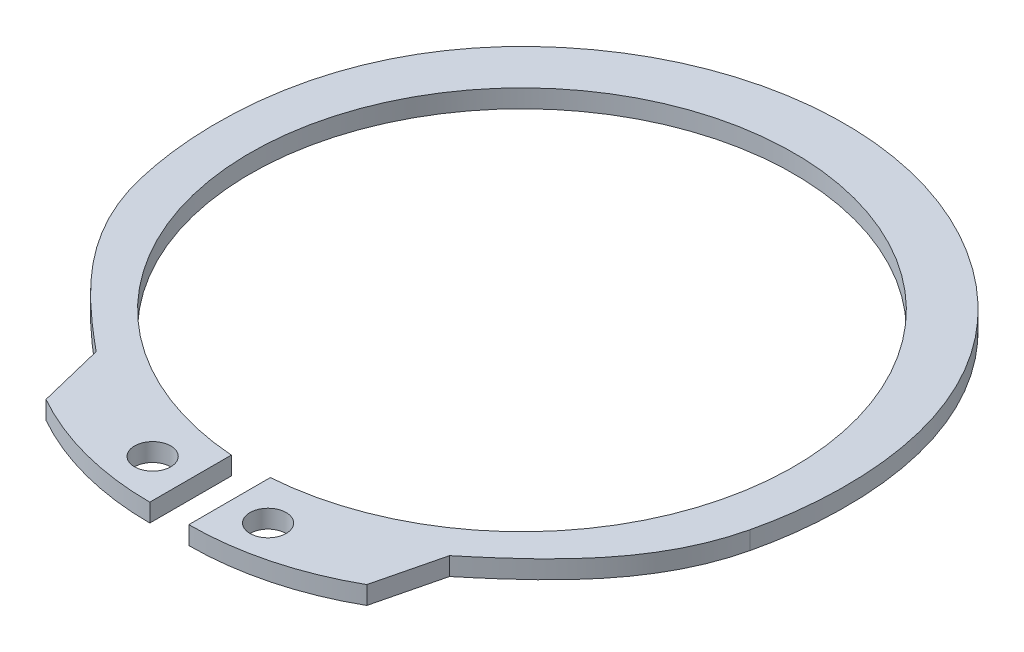
ISO-10303-21;
HEADER;
FILE_DESCRIPTION(('STEP AP214'),'2;1');
FILE_NAME('part.step','',(''),(''),'','','');
FILE_SCHEMA(('AUTOMOTIVE_DESIGN { 1 0 10303 214 1 1 1 1 }'));
ENDSEC;
DATA;
#1=APPLICATION_CONTEXT('core data for automotive mechanical design processes');
#2=APPLICATION_PROTOCOL_DEFINITION('international standard','automotive_design',2000,#1);
#3=PRODUCT_CONTEXT('',#1,'mechanical');
#4=PRODUCT('Part','Part','',(#3));
#5=PRODUCT_RELATED_PRODUCT_CATEGORY('part','',(#4));
#6=PRODUCT_DEFINITION_FORMATION('','',#4);
#7=PRODUCT_DEFINITION_CONTEXT('part definition',#1,'design');
#8=PRODUCT_DEFINITION('design','',#6,#7);
#9=PRODUCT_DEFINITION_SHAPE('','',#8);
#10=(LENGTH_UNIT() NAMED_UNIT(*) SI_UNIT(.MILLI.,.METRE.));
#11=(NAMED_UNIT(*) PLANE_ANGLE_UNIT() SI_UNIT($,.RADIAN.));
#12=(NAMED_UNIT(*) SI_UNIT($,.STERADIAN.) SOLID_ANGLE_UNIT());
#13=UNCERTAINTY_MEASURE_WITH_UNIT(LENGTH_MEASURE(1.E-05),#10,'distance_accuracy_value','');
#14=(GEOMETRIC_REPRESENTATION_CONTEXT(3) GLOBAL_UNCERTAINTY_ASSIGNED_CONTEXT((#13)) GLOBAL_UNIT_ASSIGNED_CONTEXT((#10,
#11,#12)) REPRESENTATION_CONTEXT('',''));
#15=CARTESIAN_POINT('',(0.,0.,0.));
#16=DIRECTION('',(0.,0.,1.));
#17=DIRECTION('',(1.,0.,0.));
#18=AXIS2_PLACEMENT_3D('',#15,#16,#17);
#19=CARTESIAN_POINT('',(-24.5646187762163,2.,-25.7670235840146));
#20=CARTESIAN_POINT('',(-32.2510077667625,2.,-18.439315954034));
#21=CARTESIAN_POINT('',(-35.7190076851156,2.,-6.21673721038981));
#22=CARTESIAN_POINT('',(-34.2765179406973,2.,5.5416940079121));
#23=CARTESIAN_POINT('',(-33.6081046392494,2.,8.41468235261205));
#24=B_SPLINE_CURVE_WITH_KNOTS('',3,(#19,#20,#21,#22,#23),.UNSPECIFIED.,.F.,.F.,(4,1,4),(0.,
0.765438226069232,1.),.UNSPECIFIED.);
#25=DIRECTION('',(0.,-1.,0.));
#26=VECTOR('',#25,1.);
#27=SURFACE_OF_LINEAR_EXTRUSION('',#24,#26);
#28=CARTESIAN_POINT('',(-24.5646187762163,0.,-25.7670235840146));
#29=CARTESIAN_POINT('',(-32.2510077667625,0.,-18.439315954034));
#30=CARTESIAN_POINT('',(-35.7190076851156,0.,-6.21673721038981));
#31=CARTESIAN_POINT('',(-34.2765179406973,0.,5.5416940079121));
#32=CARTESIAN_POINT('',(-33.6081046392494,0.,8.41468235261205));
#33=B_SPLINE_CURVE_WITH_KNOTS('',3,(#28,#29,#30,#31,#32),.UNSPECIFIED.,.F.,.F.,(4,1,4),(0.,
0.765438226069232,1.),.UNSPECIFIED.);
#34=CARTESIAN_POINT('',(-24.5646187762163,0.,-25.7670235840146));
#35=VERTEX_POINT('',#34);
#36=CARTESIAN_POINT('',(-33.6081046392494,0.,8.41468235261205));
#37=VERTEX_POINT('',#36);
#38=EDGE_CURVE('E268',#35,#37,#33,.T.);
#39=ORIENTED_EDGE('',*,*,#38,.T.);
#40=DIRECTION('',(0.,-1.,0.));
#41=VECTOR('',#40,1.);
#42=CARTESIAN_POINT('',(-33.6081046392494,2.,8.41468235261205));
#43=LINE('',#42,#41);
#44=CARTESIAN_POINT('',(-33.6081046392494,2.,8.41468235261205));
#45=VERTEX_POINT('',#44);
#46=EDGE_CURVE('E11',#45,#37,#43,.T.);
#47=ORIENTED_EDGE('',*,*,#46,.F.);
#48=CARTESIAN_POINT('',(-24.5646187762163,2.,-25.7670235840146));
#49=VERTEX_POINT('',#48);
#50=EDGE_CURVE('E209',#49,#45,#24,.T.);
#51=ORIENTED_EDGE('',*,*,#50,.F.);
#52=DIRECTION('',(0.,-1.,0.));
#53=VECTOR('',#52,1.);
#54=CARTESIAN_POINT('',(-24.5646187762163,2.,-25.7670235840146));
#55=LINE('',#54,#53);
#56=EDGE_CURVE('E308',#49,#35,#55,.T.);
#57=ORIENTED_EDGE('',*,*,#56,.T.);
#58=EDGE_LOOP('',(#39,#47,#51,#57));
#59=FACE_BOUND('',#58,.T.);
#60=ADVANCED_FACE('F35',(#59),#27,.F.);
#61=CARTESIAN_POINT('',(-33.6081046392494,2.,8.41468235261206));
#62=CARTESIAN_POINT('',(-31.6081672642177,2.,17.0108559418416));
#63=CARTESIAN_POINT('',(-25.4327775298712,2.,22.569195674975));
#64=CARTESIAN_POINT('',(-19.4994138637427,2.,27.4950070204402));
#65=B_SPLINE_CURVE_WITH_KNOTS('',3,(#61,#62,#63,#64),.UNSPECIFIED.,.F.,.F.,(4,4),(0.,1.),.UNSPECIFIED.);
#66=DIRECTION('',(0.,-1.,0.));
#67=VECTOR('',#66,1.);
#68=SURFACE_OF_LINEAR_EXTRUSION('',#65,#67);
#69=CARTESIAN_POINT('',(-33.6081046392494,0.,8.41468235261206));
#70=CARTESIAN_POINT('',(-31.6081672642177,0.,17.0108559418416));
#71=CARTESIAN_POINT('',(-25.4327775298712,0.,22.569195674975));
#72=CARTESIAN_POINT('',(-19.4994138637427,0.,27.4950070204402));
#73=B_SPLINE_CURVE_WITH_KNOTS('',3,(#69,#70,#71,#72),.UNSPECIFIED.,.F.,.F.,(4,4),(0.,1.),.UNSPECIFIED.);
#74=CARTESIAN_POINT('',(-19.4994138637426,0.,27.4950070204402));
#75=VERTEX_POINT('',#74);
#76=EDGE_CURVE('E263',#37,#75,#73,.T.);
#77=ORIENTED_EDGE('',*,*,#76,.T.);
#78=DIRECTION('',(0.,-1.,0.));
#79=VECTOR('',#78,1.);
#80=CARTESIAN_POINT('',(-19.4994138637426,2.,27.4950070204402));
#81=LINE('',#80,#79);
#82=CARTESIAN_POINT('',(-19.4994138637426,2.,27.4950070204402));
#83=VERTEX_POINT('',#82);
#84=EDGE_CURVE('E44',#83,#75,#81,.T.);
#85=ORIENTED_EDGE('',*,*,#84,.F.);
#86=EDGE_CURVE('E103',#45,#83,#65,.T.);
#87=ORIENTED_EDGE('',*,*,#86,.F.);
#88=ORIENTED_EDGE('',*,*,#46,.T.);
#89=EDGE_LOOP('',(#77,#85,#87,#88));
#90=FACE_BOUND('',#89,.T.);
#91=ADVANCED_FACE('F199',(#90),#68,.F.);
#92=CARTESIAN_POINT('',(-24.7519247691819,2.,6.06739296526215));
#93=DIRECTION('',(-0.971245639517392,0.,0.238079624744437));
#94=DIRECTION('',(0.238079624744437,0.,0.971245639517392));
#95=AXIS2_PLACEMENT_3D('',#92,#93,#94);
#96=PLANE('',#95);
#97=DIRECTION('',(-0.238079624744437,0.,-0.971245639517392));
#98=VECTOR('',#97,1.);
#99=CARTESIAN_POINT('',(-24.7519247691819,0.,6.06739296526215));
#100=LINE('',#99,#98);
#101=CARTESIAN_POINT('',(-17.7019944398596,0.,34.8275781285482));
#102=VERTEX_POINT('',#101);
#103=EDGE_CURVE('E260',#102,#75,#100,.T.);
#104=ORIENTED_EDGE('',*,*,#103,.F.);
#105=DIRECTION('',(0.,-1.,0.));
#106=VECTOR('',#105,1.);
#107=CARTESIAN_POINT('',(-17.7019944398596,2.,34.8275781285482));
#108=LINE('',#107,#106);
#109=CARTESIAN_POINT('',(-17.7019944398596,2.,34.8275781285482));
#110=VERTEX_POINT('',#109);
#111=EDGE_CURVE('E256',#110,#102,#108,.T.);
#112=ORIENTED_EDGE('',*,*,#111,.F.);
#113=DIRECTION('',(-0.238079624744437,0.,-0.971245639517392));
#114=VECTOR('',#113,1.);
#115=CARTESIAN_POINT('',(-24.7519247691819,2.,6.06739296526215));
#116=LINE('',#115,#114);
#117=EDGE_CURVE('E208',#110,#83,#116,.T.);
#118=ORIENTED_EDGE('',*,*,#117,.T.);
#119=ORIENTED_EDGE('',*,*,#84,.T.);
#120=EDGE_LOOP('',(#104,#112,#118,#119));
#121=FACE_BOUND('',#120,.T.);
#122=ADVANCED_FACE('F195',(#121),#96,.T.);
#123=CARTESIAN_POINT('',(-2.15185353668683,2.,7.35156770491785));
#124=DIRECTION('',(0.,-1.,0.));
#125=DIRECTION('',(0.,0.,-1.));
#126=AXIS2_PLACEMENT_3D('',#123,#124,#125);
#127=CYLINDRICAL_SURFACE('',#126,31.5711582129635);
#128=CARTESIAN_POINT('',(-2.15185353668683,0.,7.35156770491785));
#129=DIRECTION('',(0.,1.,0.));
#130=DIRECTION('',(0.,0.,1.));
#131=AXIS2_PLACEMENT_3D('',#128,#129,#130);
#132=CIRCLE('',#131,31.5711582129635);
#133=CARTESIAN_POINT('',(-2.15185353668683,0.,38.9227259178814));
#134=VERTEX_POINT('',#133);
#135=EDGE_CURVE('E274',#134,#102,#132,.F.);
#136=ORIENTED_EDGE('',*,*,#135,.F.);
#137=DIRECTION('',(0.,-1.,0.));
#138=VECTOR('',#137,1.);
#139=CARTESIAN_POINT('',(-2.15185353668683,2.,38.9227259178814));
#140=LINE('',#139,#138);
#141=CARTESIAN_POINT('',(-2.15185353668683,2.,38.9227259178814));
#142=VERTEX_POINT('',#141);
#143=EDGE_CURVE('E254',#142,#134,#140,.T.);
#144=ORIENTED_EDGE('',*,*,#143,.F.);
#145=CARTESIAN_POINT('',(-2.15185353668683,2.,7.35156770491785));
#146=DIRECTION('',(0.,1.,0.));
#147=DIRECTION('',(0.,0.,1.));
#148=AXIS2_PLACEMENT_3D('',#145,#146,#147);
#149=CIRCLE('',#148,31.5711582129635);
#150=EDGE_CURVE('E219',#142,#110,#149,.F.);
#151=ORIENTED_EDGE('',*,*,#150,.T.);
#152=ORIENTED_EDGE('',*,*,#111,.T.);
#153=EDGE_LOOP('',(#136,#144,#151,#152));
#154=FACE_BOUND('',#153,.T.);
#155=ADVANCED_FACE('F191',(#154),#127,.T.);
#156=CARTESIAN_POINT('',(-2.15185353668683,2.,0.));
#157=DIRECTION('',(1.,0.,0.));
#158=DIRECTION('',(0.,0.,-1.));
#159=AXIS2_PLACEMENT_3D('',#156,#157,#158);
#160=PLANE('',#159);
#161=DIRECTION('',(0.,0.,1.));
#162=VECTOR('',#161,1.);
#163=CARTESIAN_POINT('',(-2.15185353668683,0.,0.));
#164=LINE('',#163,#162);
#165=CARTESIAN_POINT('',(-2.15185353668683,0.,29.9227259178814));
#166=VERTEX_POINT('',#165);
#167=EDGE_CURVE('E276',#166,#134,#164,.T.);
#168=ORIENTED_EDGE('',*,*,#167,.F.);
#169=DIRECTION('',(0.,-1.,0.));
#170=VECTOR('',#169,1.);
#171=CARTESIAN_POINT('',(-2.15185353668683,2.,29.9227259178814));
#172=LINE('',#171,#170);
#173=CARTESIAN_POINT('',(-2.15185353668683,2.,29.9227259178814));
#174=VERTEX_POINT('',#173);
#175=EDGE_CURVE('E252',#174,#166,#172,.T.);
#176=ORIENTED_EDGE('',*,*,#175,.F.);
#177=DIRECTION('',(0.,0.,1.));
#178=VECTOR('',#177,1.);
#179=CARTESIAN_POINT('',(-2.15185353668683,2.,0.));
#180=LINE('',#179,#178);
#181=EDGE_CURVE('E222',#174,#142,#180,.T.);
#182=ORIENTED_EDGE('',*,*,#181,.T.);
#183=ORIENTED_EDGE('',*,*,#143,.T.);
#184=EDGE_LOOP('',(#168,#176,#182,#183));
#185=FACE_BOUND('',#184,.T.);
#186=ADVANCED_FACE('F187',(#185),#160,.T.);
#187=CARTESIAN_POINT('',(0.,2.,0.));
#188=DIRECTION('',(0.,-1.,0.));
#189=DIRECTION('',(0.,0.,-1.));
#190=AXIS2_PLACEMENT_3D('',#187,#188,#189);
#191=CYLINDRICAL_SURFACE('',#190,30.);
#192=CARTESIAN_POINT('',(0.,0.,0.));
#193=DIRECTION('',(0.,1.,0.));
#194=DIRECTION('',(0.,0.,1.));
#195=AXIS2_PLACEMENT_3D('',#192,#193,#194);
#196=CIRCLE('',#195,30.);
#197=CARTESIAN_POINT('',(2.15185353668683,0.,29.9227259178814));
#198=VERTEX_POINT('',#197);
#199=EDGE_CURVE('E283',#198,#166,#196,.T.);
#200=ORIENTED_EDGE('',*,*,#199,.F.);
#201=DIRECTION('',(0.,-1.,0.));
#202=VECTOR('',#201,1.);
#203=CARTESIAN_POINT('',(2.15185353668683,2.,29.9227259178814));
#204=LINE('',#203,#202);
#205=CARTESIAN_POINT('',(2.15185353668683,2.,29.9227259178814));
#206=VERTEX_POINT('',#205);
#207=EDGE_CURVE('E250',#206,#198,#204,.T.);
#208=ORIENTED_EDGE('',*,*,#207,.F.);
#209=CARTESIAN_POINT('',(0.,2.,0.));
#210=DIRECTION('',(0.,1.,0.));
#211=DIRECTION('',(0.,0.,1.));
#212=AXIS2_PLACEMENT_3D('',#209,#210,#211);
#213=CIRCLE('',#212,30.);
#214=EDGE_CURVE('E225',#206,#174,#213,.T.);
#215=ORIENTED_EDGE('',*,*,#214,.T.);
#216=ORIENTED_EDGE('',*,*,#175,.T.);
#217=EDGE_LOOP('',(#200,#208,#215,#216));
#218=FACE_BOUND('',#217,.T.);
#219=ADVANCED_FACE('F183',(#218),#191,.F.);
#220=CARTESIAN_POINT('',(2.15185353668683,2.,0.));
#221=DIRECTION('',(1.,0.,0.));
#222=DIRECTION('',(0.,0.,-1.));
#223=AXIS2_PLACEMENT_3D('',#220,#221,#222);
#224=PLANE('',#223);
#225=DIRECTION('',(0.,0.,1.));
#226=VECTOR('',#225,1.);
#227=CARTESIAN_POINT('',(2.15185353668683,0.,0.));
#228=LINE('',#227,#226);
#229=CARTESIAN_POINT('',(2.15185353668683,0.,38.9227259178814));
#230=VERTEX_POINT('',#229);
#231=EDGE_CURVE('E286',#198,#230,#228,.T.);
#232=ORIENTED_EDGE('',*,*,#231,.T.);
#233=DIRECTION('',(0.,-1.,0.));
#234=VECTOR('',#233,1.);
#235=CARTESIAN_POINT('',(2.15185353668683,2.,38.9227259178814));
#236=LINE('',#235,#234);
#237=CARTESIAN_POINT('',(2.15185353668683,2.,38.9227259178814));
#238=VERTEX_POINT('',#237);
#239=EDGE_CURVE('E243',#238,#230,#236,.T.);
#240=ORIENTED_EDGE('',*,*,#239,.F.);
#241=DIRECTION('',(0.,0.,1.));
#242=VECTOR('',#241,1.);
#243=CARTESIAN_POINT('',(2.15185353668683,2.,0.));
#244=LINE('',#243,#242);
#245=EDGE_CURVE('E228',#206,#238,#244,.T.);
#246=ORIENTED_EDGE('',*,*,#245,.F.);
#247=ORIENTED_EDGE('',*,*,#207,.T.);
#248=EDGE_LOOP('',(#232,#240,#246,#247));
#249=FACE_BOUND('',#248,.T.);
#250=ADVANCED_FACE('F179',(#249),#224,.F.);
#251=CARTESIAN_POINT('',(2.15185353668683,2.,7.35156770491785));
#252=DIRECTION('',(0.,-1.,0.));
#253=DIRECTION('',(0.,0.,-1.));
#254=AXIS2_PLACEMENT_3D('',#251,#252,#253);
#255=CYLINDRICAL_SURFACE('',#254,31.5711582129635);
#256=CARTESIAN_POINT('',(2.15185353668683,0.,7.35156770491785));
#257=DIRECTION('',(0.,1.,0.));
#258=DIRECTION('',(0.,0.,1.));
#259=AXIS2_PLACEMENT_3D('',#256,#257,#258);
#260=CIRCLE('',#259,31.5711582129635);
#261=CARTESIAN_POINT('',(17.7019944398596,0.,34.8275781285482));
#262=VERTEX_POINT('',#261);
#263=EDGE_CURVE('E240',#230,#262,#260,.T.);
#264=ORIENTED_EDGE('',*,*,#263,.T.);
#265=DIRECTION('',(0.,-1.,0.));
#266=VECTOR('',#265,1.);
#267=CARTESIAN_POINT('',(17.7019944398596,2.,34.8275781285482));
#268=LINE('',#267,#266);
#269=CARTESIAN_POINT('',(17.7019944398596,2.,34.8275781285482));
#270=VERTEX_POINT('',#269);
#271=EDGE_CURVE('E238',#270,#262,#268,.T.);
#272=ORIENTED_EDGE('',*,*,#271,.F.);
#273=CARTESIAN_POINT('',(2.15185353668683,2.,7.35156770491785));
#274=DIRECTION('',(0.,1.,0.));
#275=DIRECTION('',(0.,0.,1.));
#276=AXIS2_PLACEMENT_3D('',#273,#274,#275);
#277=CIRCLE('',#276,31.5711582129635);
#278=EDGE_CURVE('E230',#238,#270,#277,.T.);
#279=ORIENTED_EDGE('',*,*,#278,.F.);
#280=ORIENTED_EDGE('',*,*,#239,.T.);
#281=EDGE_LOOP('',(#264,#272,#279,#280));
#282=FACE_BOUND('',#281,.T.);
#283=ADVANCED_FACE('F175',(#282),#255,.T.);
#284=CARTESIAN_POINT('',(24.7519247691819,2.,6.06739296526215));
#285=DIRECTION('',(-0.971245639517392,0.,-0.238079624744437));
#286=DIRECTION('',(-0.238079624744437,0.,0.971245639517392));
#287=AXIS2_PLACEMENT_3D('',#284,#285,#286);
#288=PLANE('',#287);
#289=DIRECTION('',(0.238079624744437,0.,-0.971245639517392));
#290=VECTOR('',#289,1.);
#291=CARTESIAN_POINT('',(24.7519247691819,0.,6.06739296526215));
#292=LINE('',#291,#290);
#293=CARTESIAN_POINT('',(19.4994138637426,0.,27.4950070204402));
#294=VERTEX_POINT('',#293);
#295=EDGE_CURVE('E245',#262,#294,#292,.T.);
#296=ORIENTED_EDGE('',*,*,#295,.T.);
#297=DIRECTION('',(0.,-1.,0.));
#298=VECTOR('',#297,1.);
#299=CARTESIAN_POINT('',(19.4994138637426,2.,27.4950070204402));
#300=LINE('',#299,#298);
#301=CARTESIAN_POINT('',(19.4994138637426,2.,27.4950070204402));
#302=VERTEX_POINT('',#301);
#303=EDGE_CURVE('E140',#302,#294,#300,.T.);
#304=ORIENTED_EDGE('',*,*,#303,.F.);
#305=DIRECTION('',(0.238079624744437,0.,-0.971245639517392));
#306=VECTOR('',#305,1.);
#307=CARTESIAN_POINT('',(24.7519247691819,2.,6.06739296526215));
#308=LINE('',#307,#306);
#309=EDGE_CURVE('E146',#270,#302,#308,.T.);
#310=ORIENTED_EDGE('',*,*,#309,.F.);
#311=ORIENTED_EDGE('',*,*,#271,.T.);
#312=EDGE_LOOP('',(#296,#304,#310,#311));
#313=FACE_BOUND('',#312,.T.);
#314=ADVANCED_FACE('F172',(#313),#288,.F.);
#315=CARTESIAN_POINT('',(33.6081046392494,2.,8.41468235261206));
#316=CARTESIAN_POINT('',(31.6081672642177,2.,17.0108559418416));
#317=CARTESIAN_POINT('',(25.4327775298712,2.,22.569195674975));
#318=CARTESIAN_POINT('',(19.4994138637427,2.,27.4950070204402));
#319=B_SPLINE_CURVE_WITH_KNOTS('',3,(#315,#316,#317,#318),.UNSPECIFIED.,.F.,.F.,(4,4),(0.,1.),.UNSPECIFIED.);
#320=DIRECTION('',(0.,-1.,0.));
#321=VECTOR('',#320,1.);
#322=SURFACE_OF_LINEAR_EXTRUSION('',#319,#321);
#323=CARTESIAN_POINT('',(33.6081046392494,0.,8.41468235261206));
#324=CARTESIAN_POINT('',(31.6081672642177,0.,17.0108559418416));
#325=CARTESIAN_POINT('',(25.4327775298712,0.,22.569195674975));
#326=CARTESIAN_POINT('',(19.4994138637427,0.,27.4950070204402));
#327=B_SPLINE_CURVE_WITH_KNOTS('',3,(#323,#324,#325,#326),.UNSPECIFIED.,.F.,.F.,(4,4),(0.,1.),.UNSPECIFIED.);
#328=CARTESIAN_POINT('',(33.6081046392494,0.,8.41468235261205));
#329=VERTEX_POINT('',#328);
#330=EDGE_CURVE('E135',#329,#294,#327,.T.);
#331=ORIENTED_EDGE('',*,*,#330,.F.);
#332=DIRECTION('',(0.,-1.,0.));
#333=VECTOR('',#332,1.);
#334=CARTESIAN_POINT('',(33.6081046392494,2.,8.41468235261205));
#335=LINE('',#334,#333);
#336=CARTESIAN_POINT('',(33.6081046392494,2.,8.41468235261205));
#337=VERTEX_POINT('',#336);
#338=EDGE_CURVE('E130',#337,#329,#335,.T.);
#339=ORIENTED_EDGE('',*,*,#338,.F.);
#340=EDGE_CURVE('E133',#337,#302,#319,.T.);
#341=ORIENTED_EDGE('',*,*,#340,.T.);
#342=ORIENTED_EDGE('',*,*,#303,.T.);
#343=EDGE_LOOP('',(#331,#339,#341,#342));
#344=FACE_BOUND('',#343,.T.);
#345=ADVANCED_FACE('F132',(#344),#322,.T.);
#346=CARTESIAN_POINT('',(24.5646187762163,2.,-25.7670235840146));
#347=CARTESIAN_POINT('',(32.2510077667625,2.,-18.439315954034));
#348=CARTESIAN_POINT('',(35.7190076851156,2.,-6.21673721038981));
#349=CARTESIAN_POINT('',(34.2765179406973,2.,5.5416940079121));
#350=CARTESIAN_POINT('',(33.6081046392494,2.,8.41468235261205));
#351=B_SPLINE_CURVE_WITH_KNOTS('',3,(#346,#347,#348,#349,#350),.UNSPECIFIED.,.F.,.F.,(4,1,4),
(0.,0.765438226069232,1.),.UNSPECIFIED.);
#352=DIRECTION('',(0.,-1.,0.));
#353=VECTOR('',#352,1.);
#354=SURFACE_OF_LINEAR_EXTRUSION('',#351,#353);
#355=CARTESIAN_POINT('',(24.5646187762163,0.,-25.7670235840146));
#356=CARTESIAN_POINT('',(32.2510077667625,0.,-18.439315954034));
#357=CARTESIAN_POINT('',(35.7190076851156,0.,-6.21673721038981));
#358=CARTESIAN_POINT('',(34.2765179406973,0.,5.5416940079121));
#359=CARTESIAN_POINT('',(33.6081046392494,0.,8.41468235261205));
#360=B_SPLINE_CURVE_WITH_KNOTS('',3,(#355,#356,#357,#358,#359),.UNSPECIFIED.,.F.,.F.,(4,1,4),
(0.,0.765438226069232,1.),.UNSPECIFIED.);
#361=CARTESIAN_POINT('',(24.5646187762163,0.,-25.7670235840146));
#362=VERTEX_POINT('',#361);
#363=EDGE_CURVE('E293',#362,#329,#360,.T.);
#364=ORIENTED_EDGE('',*,*,#363,.F.);
#365=DIRECTION('',(0.,-1.,0.));
#366=VECTOR('',#365,1.);
#367=CARTESIAN_POINT('',(24.5646187762163,2.,-25.7670235840146));
#368=LINE('',#367,#366);
#369=CARTESIAN_POINT('',(24.5646187762163,2.,-25.7670235840146));
#370=VERTEX_POINT('',#369);
#371=EDGE_CURVE('E92',#370,#362,#368,.T.);
#372=ORIENTED_EDGE('',*,*,#371,.F.);
#373=EDGE_CURVE('E144',#370,#337,#351,.T.);
#374=ORIENTED_EDGE('',*,*,#373,.T.);
#375=ORIENTED_EDGE('',*,*,#338,.T.);
#376=EDGE_LOOP('',(#364,#372,#374,#375));
#377=FACE_BOUND('',#376,.T.);
#378=ADVANCED_FACE('F149',(#377),#354,.T.);
#379=CARTESIAN_POINT('',(0.,2.,0.));
#380=DIRECTION('',(0.,-1.,0.));
#381=DIRECTION('',(0.,0.,-1.));
#382=AXIS2_PLACEMENT_3D('',#379,#380,#381);
#383=CYLINDRICAL_SURFACE('',#382,35.6);
#384=CARTESIAN_POINT('',(0.,0.,0.));
#385=DIRECTION('',(0.,1.,0.));
#386=DIRECTION('',(0.,0.,1.));
#387=AXIS2_PLACEMENT_3D('',#384,#385,#386);
#388=CIRCLE('',#387,35.6);
#389=EDGE_CURVE('E95',#362,#35,#388,.T.);
#390=ORIENTED_EDGE('',*,*,#389,.T.);
#391=ORIENTED_EDGE('',*,*,#56,.F.);
#392=CARTESIAN_POINT('',(0.,2.,0.));
#393=DIRECTION('',(0.,1.,0.));
#394=DIRECTION('',(0.,0.,1.));
#395=AXIS2_PLACEMENT_3D('',#392,#393,#394);
#396=CIRCLE('',#395,35.6);
#397=EDGE_CURVE('E52',#370,#49,#396,.T.);
#398=ORIENTED_EDGE('',*,*,#397,.F.);
#399=ORIENTED_EDGE('',*,*,#371,.T.);
#400=EDGE_LOOP('',(#390,#391,#398,#399));
#401=FACE_BOUND('',#400,.T.);
#402=ADVANCED_FACE('F168',(#401),#383,.T.);
#403=CARTESIAN_POINT('',(-6.36889639128532,2.,34.390315296044));
#404=DIRECTION('',(0.,-1.,0.));
#405=DIRECTION('',(0.,0.,-1.));
#406=AXIS2_PLACEMENT_3D('',#403,#404,#405);
#407=CYLINDRICAL_SURFACE('',#406,2.);
#408=CARTESIAN_POINT('',(-6.36889639128532,2.,34.390315296044));
#409=DIRECTION('',(0.,1.,0.));
#410=DIRECTION('',(0.,0.,1.));
#411=AXIS2_PLACEMENT_3D('',#408,#409,#410);
#412=CIRCLE('',#411,2.);
#413=CARTESIAN_POINT('',(-6.36889639128532,2.,36.390315296044));
#414=VERTEX_POINT('',#413);
#415=EDGE_CURVE('E307',#414,#414,#412,.T.);
#416=ORIENTED_EDGE('',*,*,#415,.T.);
#417=EDGE_LOOP('',(#416));
#418=FACE_BOUND('',#417,.T.);
#419=CARTESIAN_POINT('',(-6.36889639128532,0.,34.390315296044));
#420=DIRECTION('',(0.,1.,0.));
#421=DIRECTION('',(0.,0.,1.));
#422=AXIS2_PLACEMENT_3D('',#419,#420,#421);
#423=CIRCLE('',#422,2.);
#424=CARTESIAN_POINT('',(-6.36889639128532,0.,36.390315296044));
#425=VERTEX_POINT('',#424);
#426=EDGE_CURVE('E314',#425,#425,#423,.T.);
#427=ORIENTED_EDGE('',*,*,#426,.F.);
#428=EDGE_LOOP('',(#427));
#429=FACE_BOUND('',#428,.T.);
#430=ADVANCED_FACE('F37',(#418,#429),#407,.F.);
#431=CARTESIAN_POINT('',(6.36889639128532,2.,34.390315296044));
#432=DIRECTION('',(0.,-1.,0.));
#433=DIRECTION('',(0.,0.,-1.));
#434=AXIS2_PLACEMENT_3D('',#431,#432,#433);
#435=CYLINDRICAL_SURFACE('',#434,2.);
#436=CARTESIAN_POINT('',(6.36889639128532,2.,34.390315296044));
#437=DIRECTION('',(0.,1.,0.));
#438=DIRECTION('',(0.,0.,1.));
#439=AXIS2_PLACEMENT_3D('',#436,#437,#438);
#440=CIRCLE('',#439,2.);
#441=CARTESIAN_POINT('',(6.36889639128532,2.,36.390315296044));
#442=VERTEX_POINT('',#441);
#443=EDGE_CURVE('E151',#442,#442,#440,.F.);
#444=ORIENTED_EDGE('',*,*,#443,.F.);
#445=EDGE_LOOP('',(#444));
#446=FACE_BOUND('',#445,.T.);
#447=CARTESIAN_POINT('',(6.36889639128532,0.,34.390315296044));
#448=DIRECTION('',(0.,1.,0.));
#449=DIRECTION('',(0.,0.,1.));
#450=AXIS2_PLACEMENT_3D('',#447,#448,#449);
#451=CIRCLE('',#450,2.);
#452=CARTESIAN_POINT('',(6.36889639128532,0.,36.390315296044));
#453=VERTEX_POINT('',#452);
#454=EDGE_CURVE('E304',#453,#453,#451,.F.);
#455=ORIENTED_EDGE('',*,*,#454,.T.);
#456=EDGE_LOOP('',(#455));
#457=FACE_BOUND('',#456,.T.);
#458=ADVANCED_FACE('F332',(#446,#457),#435,.F.);
#459=CARTESIAN_POINT('',(0.,2.,0.));
#460=DIRECTION('',(0.,1.,0.));
#461=DIRECTION('',(0.,0.,1.));
#462=AXIS2_PLACEMENT_3D('',#459,#460,#461);
#463=PLANE('',#462);
#464=ORIENTED_EDGE('',*,*,#415,.F.);
#465=EDGE_LOOP('',(#464));
#466=FACE_BOUND('',#465,.T.);
#467=ORIENTED_EDGE('',*,*,#50,.T.);
#468=ORIENTED_EDGE('',*,*,#86,.T.);
#469=ORIENTED_EDGE('',*,*,#117,.F.);
#470=ORIENTED_EDGE('',*,*,#150,.F.);
#471=ORIENTED_EDGE('',*,*,#181,.F.);
#472=ORIENTED_EDGE('',*,*,#214,.F.);
#473=ORIENTED_EDGE('',*,*,#245,.T.);
#474=ORIENTED_EDGE('',*,*,#278,.T.);
#475=ORIENTED_EDGE('',*,*,#309,.T.);
#476=ORIENTED_EDGE('',*,*,#340,.F.);
#477=ORIENTED_EDGE('',*,*,#373,.F.);
#478=ORIENTED_EDGE('',*,*,#397,.T.);
#479=EDGE_LOOP('',(#467,#468,#469,#470,#471,#472,#473,#474,#475,#476,#477,#478));
#480=FACE_BOUND('',#479,.T.);
#481=ORIENTED_EDGE('',*,*,#443,.T.);
#482=EDGE_LOOP('',(#481));
#483=FACE_BOUND('',#482,.T.);
#484=ADVANCED_FACE('F142',(#466,#480,#483),#463,.T.);
#485=CARTESIAN_POINT('',(0.,0.,0.));
#486=DIRECTION('',(0.,1.,0.));
#487=DIRECTION('',(0.,0.,1.));
#488=AXIS2_PLACEMENT_3D('',#485,#486,#487);
#489=PLANE('',#488);
#490=ORIENTED_EDGE('',*,*,#426,.T.);
#491=EDGE_LOOP('',(#490));
#492=FACE_BOUND('',#491,.T.);
#493=ORIENTED_EDGE('',*,*,#38,.F.);
#494=ORIENTED_EDGE('',*,*,#389,.F.);
#495=ORIENTED_EDGE('',*,*,#363,.T.);
#496=ORIENTED_EDGE('',*,*,#330,.T.);
#497=ORIENTED_EDGE('',*,*,#295,.F.);
#498=ORIENTED_EDGE('',*,*,#263,.F.);
#499=ORIENTED_EDGE('',*,*,#231,.F.);
#500=ORIENTED_EDGE('',*,*,#199,.T.);
#501=ORIENTED_EDGE('',*,*,#167,.T.);
#502=ORIENTED_EDGE('',*,*,#135,.T.);
#503=ORIENTED_EDGE('',*,*,#103,.T.);
#504=ORIENTED_EDGE('',*,*,#76,.F.);
#505=EDGE_LOOP('',(#493,#494,#495,#496,#497,#498,#499,#500,#501,#502,#503,#504));
#506=FACE_BOUND('',#505,.T.);
#507=ORIENTED_EDGE('',*,*,#454,.F.);
#508=EDGE_LOOP('',(#507));
#509=FACE_BOUND('',#508,.T.);
#510=ADVANCED_FACE('F270',(#492,#506,#509),#489,.F.);
#511=CLOSED_SHELL('',(#60,#91,#122,#155,#186,#219,#250,#283,#314,#345,#378,#402,#430,#458,#484,#510));
#512=MANIFOLD_SOLID_BREP('B2',#511);
#513=ADVANCED_BREP_SHAPE_REPRESENTATION('',(#18,#512),#14);
#514=SHAPE_DEFINITION_REPRESENTATION(#9,#513);
ENDSEC;
END-ISO-10303-21;
